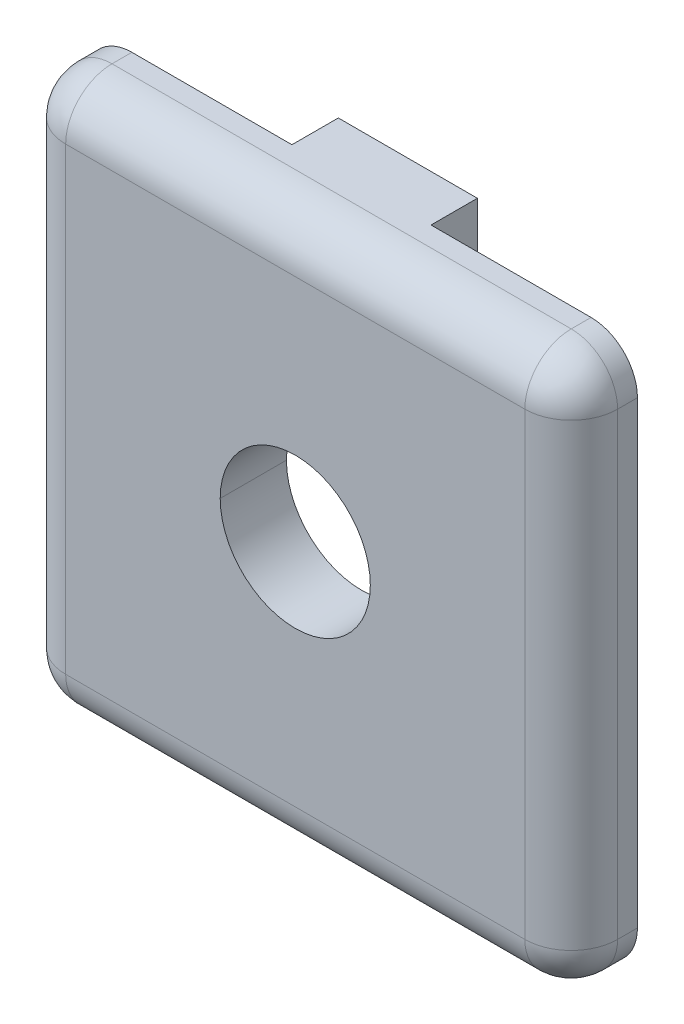
ISO-10303-21;
HEADER;
FILE_DESCRIPTION(('STEP AP214'),'2;1');
FILE_NAME('part.step','',(''),(''),'','','');
FILE_SCHEMA(('AUTOMOTIVE_DESIGN { 1 0 10303 214 1 1 1 1 }'));
ENDSEC;
DATA;
#1=APPLICATION_CONTEXT('core data for automotive mechanical design processes');
#2=APPLICATION_PROTOCOL_DEFINITION('international standard','automotive_design',2000,#1);
#3=PRODUCT_CONTEXT('',#1,'mechanical');
#4=PRODUCT('Part','Part','',(#3));
#5=PRODUCT_RELATED_PRODUCT_CATEGORY('part','',(#4));
#6=PRODUCT_DEFINITION_FORMATION('','',#4);
#7=PRODUCT_DEFINITION_CONTEXT('part definition',#1,'design');
#8=PRODUCT_DEFINITION('design','',#6,#7);
#9=PRODUCT_DEFINITION_SHAPE('','',#8);
#10=(LENGTH_UNIT() NAMED_UNIT(*) SI_UNIT(.MILLI.,.METRE.));
#11=(NAMED_UNIT(*) PLANE_ANGLE_UNIT() SI_UNIT($,.RADIAN.));
#12=(NAMED_UNIT(*) SI_UNIT($,.STERADIAN.) SOLID_ANGLE_UNIT());
#13=UNCERTAINTY_MEASURE_WITH_UNIT(LENGTH_MEASURE(1.E-05),#10,'distance_accuracy_value','');
#14=(GEOMETRIC_REPRESENTATION_CONTEXT(3) GLOBAL_UNCERTAINTY_ASSIGNED_CONTEXT((#13)) GLOBAL_UNIT_ASSIGNED_CONTEXT((#10,
#11,#12)) REPRESENTATION_CONTEXT('',''));
#15=CARTESIAN_POINT('',(0.,0.,0.));
#16=DIRECTION('',(0.,0.,1.));
#17=DIRECTION('',(1.,0.,0.));
#18=AXIS2_PLACEMENT_3D('',#15,#16,#17);
#19=CARTESIAN_POINT('',(10.4,10.3999999999998,-2.10000000000017));
#20=DIRECTION('',(0.,0.,-1.));
#21=DIRECTION('',(-0.707106781186514,-0.707106781186581,0.));
#22=AXIS2_PLACEMENT_3D('',#19,#20,#21);
#23=SPHERICAL_SURFACE('',#22,2.1);
#24=CARTESIAN_POINT('',(10.3999999999998,10.4,-2.10000000000017));
#25=DIRECTION('',(0.,-1.,0.));
#26=DIRECTION('',(0.,0.,1.));
#27=AXIS2_PLACEMENT_3D('',#24,#25,#26);
#28=CIRCLE('',#27,2.1);
#29=CARTESIAN_POINT('',(12.5,10.4,-2.1));
#30=VERTEX_POINT('',#29);
#31=CARTESIAN_POINT('',(10.4,10.4,0.));
#32=VERTEX_POINT('',#31);
#33=EDGE_CURVE('E11',#30,#32,#28,.T.);
#34=ORIENTED_EDGE('',*,*,#33,.F.);
#35=CARTESIAN_POINT('',(10.4,10.4,-2.1));
#36=DIRECTION('',(0.,0.,-1.));
#37=DIRECTION('',(-1.,0.,0.));
#38=AXIS2_PLACEMENT_3D('',#35,#36,#37);
#39=CIRCLE('',#38,2.1);
#40=CARTESIAN_POINT('',(10.4,12.5,-2.1));
#41=VERTEX_POINT('',#40);
#42=EDGE_CURVE('E25',#41,#30,#39,.T.);
#43=ORIENTED_EDGE('',*,*,#42,.F.);
#44=CARTESIAN_POINT('',(10.4,10.4000000000004,-2.09999999999957));
#45=DIRECTION('',(1.,0.,0.));
#46=DIRECTION('',(0.,0.,-1.));
#47=AXIS2_PLACEMENT_3D('',#44,#45,#46);
#48=CIRCLE('',#47,2.1);
#49=EDGE_CURVE('E370',#41,#32,#48,.T.);
#50=ORIENTED_EDGE('',*,*,#49,.T.);
#51=EDGE_LOOP('',(#34,#43,#50));
#52=FACE_BOUND('',#51,.T.);
#53=ADVANCED_FACE('F17',(#52),#23,.T.);
#54=CARTESIAN_POINT('',(10.4,10.4000000000004,-2.09999999999957));
#55=DIRECTION('',(1.,0.,0.));
#56=DIRECTION('',(0.,-0.707106781186552,-0.707106781186543));
#57=AXIS2_PLACEMENT_3D('',#54,#55,#56);
#58=CYLINDRICAL_SURFACE('',#57,2.1);
#59=CARTESIAN_POINT('',(-10.4,10.4000000000004,-2.09999999999957));
#60=DIRECTION('',(1.,0.,0.));
#61=DIRECTION('',(0.,0.,-1.));
#62=AXIS2_PLACEMENT_3D('',#59,#60,#61);
#63=CIRCLE('',#62,2.1);
#64=CARTESIAN_POINT('',(-10.4,12.5,-2.1));
#65=VERTEX_POINT('',#64);
#66=CARTESIAN_POINT('',(-10.4,10.4,0.));
#67=VERTEX_POINT('',#66);
#68=EDGE_CURVE('E366',#65,#67,#63,.T.);
#69=ORIENTED_EDGE('',*,*,#68,.T.);
#70=DIRECTION('',(-1.,0.,0.));
#71=VECTOR('',#70,1.);
#72=CARTESIAN_POINT('',(10.4,10.4,0.));
#73=LINE('',#72,#71);
#74=EDGE_CURVE('E361',#32,#67,#73,.T.);
#75=ORIENTED_EDGE('',*,*,#74,.F.);
#76=ORIENTED_EDGE('',*,*,#49,.F.);
#77=DIRECTION('',(-1.,0.,0.));
#78=VECTOR('',#77,1.);
#79=CARTESIAN_POINT('',(10.4,12.5,-2.1));
#80=LINE('',#79,#78);
#81=EDGE_CURVE('E357',#41,#65,#80,.T.);
#82=ORIENTED_EDGE('',*,*,#81,.T.);
#83=EDGE_LOOP('',(#69,#75,#76,#82));
#84=FACE_BOUND('',#83,.T.);
#85=ADVANCED_FACE('F406',(#84),#58,.T.);
#86=CARTESIAN_POINT('',(10.4,12.5,-3.));
#87=DIRECTION('',(0.,-1.,0.));
#88=DIRECTION('',(0.,0.,-1.));
#89=AXIS2_PLACEMENT_3D('',#86,#87,#88);
#90=PLANE('',#89);
#91=DIRECTION('',(0.,0.,1.));
#92=VECTOR('',#91,1.);
#93=CARTESIAN_POINT('',(-10.4,12.5,-3.));
#94=LINE('',#93,#92);
#95=CARTESIAN_POINT('',(-10.4,12.5,-3.));
#96=VERTEX_POINT('',#95);
#97=EDGE_CURVE('E352',#96,#65,#94,.T.);
#98=ORIENTED_EDGE('',*,*,#97,.T.);
#99=ORIENTED_EDGE('',*,*,#81,.F.);
#100=DIRECTION('',(0.,0.,1.));
#101=VECTOR('',#100,1.);
#102=CARTESIAN_POINT('',(10.4,12.5,-3.));
#103=LINE('',#102,#101);
#104=CARTESIAN_POINT('',(10.4,12.5,-3.));
#105=VERTEX_POINT('',#104);
#106=EDGE_CURVE('E347',#105,#41,#103,.T.);
#107=ORIENTED_EDGE('',*,*,#106,.F.);
#108=DIRECTION('',(-1.,0.,0.));
#109=VECTOR('',#108,1.);
#110=CARTESIAN_POINT('',(10.4,12.5,-3.));
#111=LINE('',#110,#109);
#112=CARTESIAN_POINT('',(3.15,12.5,-3.));
#113=VERTEX_POINT('',#112);
#114=EDGE_CURVE('E343',#105,#113,#111,.T.);
#115=ORIENTED_EDGE('',*,*,#114,.T.);
#116=DIRECTION('',(0.,0.,1.));
#117=VECTOR('',#116,1.);
#118=CARTESIAN_POINT('',(3.15,12.5,-5.1));
#119=LINE('',#118,#117);
#120=CARTESIAN_POINT('',(3.15,12.5,-5.1));
#121=VERTEX_POINT('',#120);
#122=EDGE_CURVE('E338',#121,#113,#119,.T.);
#123=ORIENTED_EDGE('',*,*,#122,.F.);
#124=DIRECTION('',(-1.,0.,0.));
#125=VECTOR('',#124,1.);
#126=CARTESIAN_POINT('',(3.15,12.5,-5.1));
#127=LINE('',#126,#125);
#128=CARTESIAN_POINT('',(-3.15,12.5,-5.1));
#129=VERTEX_POINT('',#128);
#130=EDGE_CURVE('E334',#121,#129,#127,.T.);
#131=ORIENTED_EDGE('',*,*,#130,.T.);
#132=DIRECTION('',(0.,0.,1.));
#133=VECTOR('',#132,1.);
#134=CARTESIAN_POINT('',(-3.15,12.5,-5.1));
#135=LINE('',#134,#133);
#136=CARTESIAN_POINT('',(-3.15,12.5,-3.));
#137=VERTEX_POINT('',#136);
#138=EDGE_CURVE('E148',#129,#137,#135,.T.);
#139=ORIENTED_EDGE('',*,*,#138,.T.);
#140=DIRECTION('',(-1.,0.,0.));
#141=VECTOR('',#140,1.);
#142=CARTESIAN_POINT('',(10.4,12.5,-3.));
#143=LINE('',#142,#141);
#144=EDGE_CURVE('E327',#137,#96,#143,.T.);
#145=ORIENTED_EDGE('',*,*,#144,.T.);
#146=EDGE_LOOP('',(#98,#99,#107,#115,#123,#131,#139,#145));
#147=FACE_BOUND('',#146,.T.);
#148=ADVANCED_FACE('F385',(#147),#90,.F.);
#149=CARTESIAN_POINT('',(10.4,10.4,-3.));
#150=DIRECTION('',(0.,0.,1.));
#151=DIRECTION('',(1.,0.,0.));
#152=AXIS2_PLACEMENT_3D('',#149,#150,#151);
#153=PLANE('',#152);
#154=CARTESIAN_POINT('',(0.,0.,-3.));
#155=DIRECTION('',(0.,0.,1.));
#156=DIRECTION('',(1.,0.,0.));
#157=AXIS2_PLACEMENT_3D('',#154,#155,#156);
#158=CIRCLE('',#157,3.4);
#159=CARTESIAN_POINT('',(3.4,0.,-3.));
#160=VERTEX_POINT('',#159);
#161=CARTESIAN_POINT('',(-3.4,0.,-3.));
#162=VERTEX_POINT('',#161);
#163=EDGE_CURVE('E323',#160,#162,#158,.T.);
#164=ORIENTED_EDGE('',*,*,#163,.T.);
#165=CARTESIAN_POINT('',(0.,0.,-3.));
#166=DIRECTION('',(0.,0.,1.));
#167=DIRECTION('',(1.,0.,0.));
#168=AXIS2_PLACEMENT_3D('',#165,#166,#167);
#169=CIRCLE('',#168,3.4);
#170=EDGE_CURVE('E319',#162,#160,#169,.T.);
#171=ORIENTED_EDGE('',*,*,#170,.T.);
#172=EDGE_LOOP('',(#164,#171));
#173=FACE_BOUND('',#172,.T.);
#174=ORIENTED_EDGE('',*,*,#144,.F.);
#175=DIRECTION('',(0.,-1.,0.));
#176=VECTOR('',#175,1.);
#177=CARTESIAN_POINT('',(-3.15,12.5,-3.));
#178=LINE('',#177,#176);
#179=CARTESIAN_POINT('',(-3.15,10.4,-3.));
#180=VERTEX_POINT('',#179);
#181=EDGE_CURVE('E315',#137,#180,#178,.T.);
#182=ORIENTED_EDGE('',*,*,#181,.T.);
#183=DIRECTION('',(1.,0.,0.));
#184=VECTOR('',#183,1.);
#185=CARTESIAN_POINT('',(-3.15,10.4,-3.));
#186=LINE('',#185,#184);
#187=CARTESIAN_POINT('',(3.15,10.4,-3.));
#188=VERTEX_POINT('',#187);
#189=EDGE_CURVE('E143',#180,#188,#186,.T.);
#190=ORIENTED_EDGE('',*,*,#189,.T.);
#191=DIRECTION('',(0.,1.,0.));
#192=VECTOR('',#191,1.);
#193=CARTESIAN_POINT('',(3.15,10.4,-3.));
#194=LINE('',#193,#192);
#195=EDGE_CURVE('E307',#188,#113,#194,.T.);
#196=ORIENTED_EDGE('',*,*,#195,.T.);
#197=ORIENTED_EDGE('',*,*,#114,.F.);
#198=CARTESIAN_POINT('',(10.4,10.4,-3.));
#199=DIRECTION('',(0.,0.,-1.));
#200=DIRECTION('',(-1.,0.,0.));
#201=AXIS2_PLACEMENT_3D('',#198,#199,#200);
#202=CIRCLE('',#201,2.1);
#203=CARTESIAN_POINT('',(12.5,10.4,-3.));
#204=VERTEX_POINT('',#203);
#205=EDGE_CURVE('E303',#105,#204,#202,.T.);
#206=ORIENTED_EDGE('',*,*,#205,.T.);
#207=DIRECTION('',(0.,1.,0.));
#208=VECTOR('',#207,1.);
#209=CARTESIAN_POINT('',(12.5,-10.4,-3.));
#210=LINE('',#209,#208);
#211=CARTESIAN_POINT('',(12.5,-10.4,-3.));
#212=VERTEX_POINT('',#211);
#213=EDGE_CURVE('E298',#212,#204,#210,.T.);
#214=ORIENTED_EDGE('',*,*,#213,.F.);
#215=CARTESIAN_POINT('',(10.4,-10.4,-3.));
#216=DIRECTION('',(0.,0.,-1.));
#217=DIRECTION('',(-1.,0.,0.));
#218=AXIS2_PLACEMENT_3D('',#215,#216,#217);
#219=CIRCLE('',#218,2.1);
#220=CARTESIAN_POINT('',(10.4,-12.5,-3.));
#221=VERTEX_POINT('',#220);
#222=EDGE_CURVE('E294',#212,#221,#219,.T.);
#223=ORIENTED_EDGE('',*,*,#222,.T.);
#224=DIRECTION('',(1.,0.,0.));
#225=VECTOR('',#224,1.);
#226=CARTESIAN_POINT('',(-10.4,-12.5,-3.));
#227=LINE('',#226,#225);
#228=CARTESIAN_POINT('',(-10.4,-12.5,-3.));
#229=VERTEX_POINT('',#228);
#230=EDGE_CURVE('E289',#229,#221,#227,.T.);
#231=ORIENTED_EDGE('',*,*,#230,.F.);
#232=CARTESIAN_POINT('',(-10.4,-10.4,-3.));
#233=DIRECTION('',(0.,0.,-1.));
#234=DIRECTION('',(-1.,0.,0.));
#235=AXIS2_PLACEMENT_3D('',#232,#233,#234);
#236=CIRCLE('',#235,2.1);
#237=CARTESIAN_POINT('',(-12.5,-10.4,-3.));
#238=VERTEX_POINT('',#237);
#239=EDGE_CURVE('E285',#229,#238,#236,.T.);
#240=ORIENTED_EDGE('',*,*,#239,.T.);
#241=DIRECTION('',(0.,-1.,0.));
#242=VECTOR('',#241,1.);
#243=CARTESIAN_POINT('',(-12.5,10.4,-3.));
#244=LINE('',#243,#242);
#245=CARTESIAN_POINT('',(-12.5,10.4,-3.));
#246=VERTEX_POINT('',#245);
#247=EDGE_CURVE('E280',#246,#238,#244,.T.);
#248=ORIENTED_EDGE('',*,*,#247,.F.);
#249=CARTESIAN_POINT('',(-10.4,10.4,-3.));
#250=DIRECTION('',(0.,0.,1.));
#251=DIRECTION('',(1.,0.,0.));
#252=AXIS2_PLACEMENT_3D('',#249,#250,#251);
#253=CIRCLE('',#252,2.1);
#254=EDGE_CURVE('E275',#96,#246,#253,.T.);
#255=ORIENTED_EDGE('',*,*,#254,.F.);
#256=EDGE_LOOP('',(#174,#182,#190,#196,#197,#206,#214,#223,#231,#240,#248,#255));
#257=FACE_BOUND('',#256,.T.);
#258=ADVANCED_FACE('F388',(#173,#257),#153,.F.);
#259=CARTESIAN_POINT('',(-10.4,10.4,0.));
#260=DIRECTION('',(0.,0.,-1.));
#261=DIRECTION('',(0.707106781186547,-0.707106781186548,0.));
#262=AXIS2_PLACEMENT_3D('',#259,#260,#261);
#263=CYLINDRICAL_SURFACE('',#262,2.1);
#264=CARTESIAN_POINT('',(-10.4,10.4,-2.1));
#265=DIRECTION('',(0.,0.,1.));
#266=DIRECTION('',(1.,0.,0.));
#267=AXIS2_PLACEMENT_3D('',#264,#265,#266);
#268=CIRCLE('',#267,2.1);
#269=CARTESIAN_POINT('',(-12.5,10.4,-2.1));
#270=VERTEX_POINT('',#269);
#271=EDGE_CURVE('E270',#65,#270,#268,.T.);
#272=ORIENTED_EDGE('',*,*,#271,.F.);
#273=ORIENTED_EDGE('',*,*,#97,.F.);
#274=ORIENTED_EDGE('',*,*,#254,.T.);
#275=DIRECTION('',(0.,0.,1.));
#276=VECTOR('',#275,1.);
#277=CARTESIAN_POINT('',(-12.5,10.4,-3.));
#278=LINE('',#277,#276);
#279=EDGE_CURVE('E266',#246,#270,#278,.T.);
#280=ORIENTED_EDGE('',*,*,#279,.T.);
#281=EDGE_LOOP('',(#272,#273,#274,#280));
#282=FACE_BOUND('',#281,.T.);
#283=ADVANCED_FACE('F397',(#282),#263,.T.);
#284=CARTESIAN_POINT('',(-12.5,10.4,-3.));
#285=DIRECTION('',(1.,0.,0.));
#286=DIRECTION('',(0.,0.,-1.));
#287=AXIS2_PLACEMENT_3D('',#284,#285,#286);
#288=PLANE('',#287);
#289=DIRECTION('',(0.,0.,-1.));
#290=VECTOR('',#289,1.);
#291=CARTESIAN_POINT('',(-12.5,-10.4,-2.1));
#292=LINE('',#291,#290);
#293=CARTESIAN_POINT('',(-12.5,-10.4,-2.1));
#294=VERTEX_POINT('',#293);
#295=EDGE_CURVE('E261',#294,#238,#292,.T.);
#296=ORIENTED_EDGE('',*,*,#295,.F.);
#297=DIRECTION('',(0.,-1.,0.));
#298=VECTOR('',#297,1.);
#299=CARTESIAN_POINT('',(-12.5,10.4,-2.1));
#300=LINE('',#299,#298);
#301=EDGE_CURVE('E256',#270,#294,#300,.T.);
#302=ORIENTED_EDGE('',*,*,#301,.F.);
#303=ORIENTED_EDGE('',*,*,#279,.F.);
#304=ORIENTED_EDGE('',*,*,#247,.T.);
#305=EDGE_LOOP('',(#296,#302,#303,#304));
#306=FACE_BOUND('',#305,.T.);
#307=ADVANCED_FACE('F441',(#306),#288,.F.);
#308=CARTESIAN_POINT('',(-10.3999999999998,10.4,-2.10000000000017));
#309=DIRECTION('',(0.,1.,0.));
#310=DIRECTION('',(0.707106781186581,0.,-0.707106781186514));
#311=AXIS2_PLACEMENT_3D('',#308,#309,#310);
#312=CYLINDRICAL_SURFACE('',#311,2.1);
#313=CARTESIAN_POINT('',(-10.3999999999998,-10.4,-2.10000000000017));
#314=DIRECTION('',(0.,1.,0.));
#315=DIRECTION('',(0.,0.,1.));
#316=AXIS2_PLACEMENT_3D('',#313,#314,#315);
#317=CIRCLE('',#316,2.1);
#318=CARTESIAN_POINT('',(-10.4,-10.4,0.));
#319=VERTEX_POINT('',#318);
#320=EDGE_CURVE('E252',#294,#319,#317,.T.);
#321=ORIENTED_EDGE('',*,*,#320,.T.);
#322=DIRECTION('',(0.,-1.,0.));
#323=VECTOR('',#322,1.);
#324=CARTESIAN_POINT('',(-10.4,10.4,0.));
#325=LINE('',#324,#323);
#326=EDGE_CURVE('E247',#67,#319,#325,.T.);
#327=ORIENTED_EDGE('',*,*,#326,.F.);
#328=CARTESIAN_POINT('',(-10.4,10.4,-2.1));
#329=DIRECTION('',(0.,-1.,0.));
#330=DIRECTION('',(0.,0.,1.));
#331=AXIS2_PLACEMENT_3D('',#328,#329,#330);
#332=CIRCLE('',#331,2.1);
#333=EDGE_CURVE('E242',#67,#270,#332,.T.);
#334=ORIENTED_EDGE('',*,*,#333,.T.);
#335=ORIENTED_EDGE('',*,*,#301,.T.);
#336=EDGE_LOOP('',(#321,#327,#334,#335));
#337=FACE_BOUND('',#336,.T.);
#338=ADVANCED_FACE('F408',(#337),#312,.T.);
#339=CARTESIAN_POINT('',(-10.4,10.4,-2.1));
#340=DIRECTION('',(0.,0.,1.));
#341=DIRECTION('',(0.707106781186547,-0.707106781186548,0.));
#342=AXIS2_PLACEMENT_3D('',#339,#340,#341);
#343=SPHERICAL_SURFACE('',#342,2.1);
#344=ORIENTED_EDGE('',*,*,#68,.F.);
#345=ORIENTED_EDGE('',*,*,#271,.T.);
#346=ORIENTED_EDGE('',*,*,#333,.F.);
#347=EDGE_LOOP('',(#344,#345,#346));
#348=FACE_BOUND('',#347,.T.);
#349=ADVANCED_FACE('F402',(#348),#343,.T.);
#350=CARTESIAN_POINT('',(0.,0.,0.));
#351=DIRECTION('',(0.,0.,1.));
#352=DIRECTION('',(1.,0.,0.));
#353=AXIS2_PLACEMENT_3D('',#350,#351,#352);
#354=PLANE('',#353);
#355=CARTESIAN_POINT('',(0.,0.,0.));
#356=DIRECTION('',(0.,0.,1.));
#357=DIRECTION('',(1.,0.,0.));
#358=AXIS2_PLACEMENT_3D('',#355,#356,#357);
#359=CIRCLE('',#358,3.4);
#360=CARTESIAN_POINT('',(3.4,0.,0.));
#361=VERTEX_POINT('',#360);
#362=CARTESIAN_POINT('',(-3.4,0.,0.));
#363=VERTEX_POINT('',#362);
#364=EDGE_CURVE('E237',#361,#363,#359,.T.);
#365=ORIENTED_EDGE('',*,*,#364,.F.);
#366=CARTESIAN_POINT('',(0.,0.,0.));
#367=DIRECTION('',(0.,0.,1.));
#368=DIRECTION('',(1.,0.,0.));
#369=AXIS2_PLACEMENT_3D('',#366,#367,#368);
#370=CIRCLE('',#369,3.4);
#371=EDGE_CURVE('E232',#363,#361,#370,.T.);
#372=ORIENTED_EDGE('',*,*,#371,.F.);
#373=EDGE_LOOP('',(#365,#372));
#374=FACE_BOUND('',#373,.T.);
#375=ORIENTED_EDGE('',*,*,#74,.T.);
#376=ORIENTED_EDGE('',*,*,#326,.T.);
#377=DIRECTION('',(1.,0.,0.));
#378=VECTOR('',#377,1.);
#379=CARTESIAN_POINT('',(-10.4,-10.4,0.));
#380=LINE('',#379,#378);
#381=CARTESIAN_POINT('',(10.4,-10.4,0.));
#382=VERTEX_POINT('',#381);
#383=EDGE_CURVE('E228',#319,#382,#380,.T.);
#384=ORIENTED_EDGE('',*,*,#383,.T.);
#385=DIRECTION('',(0.,1.,0.));
#386=VECTOR('',#385,1.);
#387=CARTESIAN_POINT('',(10.4,-10.4,0.));
#388=LINE('',#387,#386);
#389=EDGE_CURVE('E223',#382,#32,#388,.T.);
#390=ORIENTED_EDGE('',*,*,#389,.T.);
#391=EDGE_LOOP('',(#375,#376,#384,#390));
#392=FACE_BOUND('',#391,.T.);
#393=ADVANCED_FACE('F411',(#374,#392),#354,.T.);
#394=CARTESIAN_POINT('',(10.3999999999998,-10.4,-2.10000000000017));
#395=DIRECTION('',(0.,-1.,0.));
#396=DIRECTION('',(-0.707106781186548,0.,-0.707106781186547));
#397=AXIS2_PLACEMENT_3D('',#394,#395,#396);
#398=CYLINDRICAL_SURFACE('',#397,2.1);
#399=ORIENTED_EDGE('',*,*,#33,.T.);
#400=ORIENTED_EDGE('',*,*,#389,.F.);
#401=CARTESIAN_POINT('',(10.3999999999998,-10.4,-2.10000000000017));
#402=DIRECTION('',(0.,-1.,0.));
#403=DIRECTION('',(1.,0.,0.));
#404=AXIS2_PLACEMENT_3D('',#401,#402,#403);
#405=CIRCLE('',#404,2.1);
#406=CARTESIAN_POINT('',(12.5,-10.4,-2.1));
#407=VERTEX_POINT('',#406);
#408=EDGE_CURVE('E218',#407,#382,#405,.T.);
#409=ORIENTED_EDGE('',*,*,#408,.F.);
#410=DIRECTION('',(0.,1.,0.));
#411=VECTOR('',#410,1.);
#412=CARTESIAN_POINT('',(12.5,-10.4,-2.1));
#413=LINE('',#412,#411);
#414=EDGE_CURVE('E214',#407,#30,#413,.T.);
#415=ORIENTED_EDGE('',*,*,#414,.T.);
#416=EDGE_LOOP('',(#399,#400,#409,#415));
#417=FACE_BOUND('',#416,.T.);
#418=ADVANCED_FACE('F426',(#417),#398,.T.);
#419=CARTESIAN_POINT('',(12.5,-10.4,-3.));
#420=DIRECTION('',(-1.,0.,0.));
#421=DIRECTION('',(0.,0.,1.));
#422=AXIS2_PLACEMENT_3D('',#419,#420,#421);
#423=PLANE('',#422);
#424=DIRECTION('',(0.,0.,-1.));
#425=VECTOR('',#424,1.);
#426=CARTESIAN_POINT('',(12.5,10.4,-2.1));
#427=LINE('',#426,#425);
#428=EDGE_CURVE('E209',#30,#204,#427,.T.);
#429=ORIENTED_EDGE('',*,*,#428,.F.);
#430=ORIENTED_EDGE('',*,*,#414,.F.);
#431=DIRECTION('',(0.,0.,1.));
#432=VECTOR('',#431,1.);
#433=CARTESIAN_POINT('',(12.5,-10.4,-3.));
#434=LINE('',#433,#432);
#435=EDGE_CURVE('E204',#212,#407,#434,.T.);
#436=ORIENTED_EDGE('',*,*,#435,.F.);
#437=ORIENTED_EDGE('',*,*,#213,.T.);
#438=EDGE_LOOP('',(#429,#430,#436,#437));
#439=FACE_BOUND('',#438,.T.);
#440=ADVANCED_FACE('F429',(#439),#423,.F.);
#441=CARTESIAN_POINT('',(10.4,-10.4,-3.));
#442=DIRECTION('',(0.,0.,1.));
#443=DIRECTION('',(-0.707106781186548,0.707106781186548,0.));
#444=AXIS2_PLACEMENT_3D('',#441,#442,#443);
#445=CYLINDRICAL_SURFACE('',#444,2.1);
#446=ORIENTED_EDGE('',*,*,#222,.F.);
#447=ORIENTED_EDGE('',*,*,#435,.T.);
#448=CARTESIAN_POINT('',(10.4,-10.4,-2.1));
#449=DIRECTION('',(0.,0.,-1.));
#450=DIRECTION('',(-1.,0.,0.));
#451=AXIS2_PLACEMENT_3D('',#448,#449,#450);
#452=CIRCLE('',#451,2.1);
#453=CARTESIAN_POINT('',(10.4,-12.5,-2.1));
#454=VERTEX_POINT('',#453);
#455=EDGE_CURVE('E200',#407,#454,#452,.T.);
#456=ORIENTED_EDGE('',*,*,#455,.T.);
#457=DIRECTION('',(0.,0.,-1.));
#458=VECTOR('',#457,1.);
#459=CARTESIAN_POINT('',(10.4,-12.5,-2.1));
#460=LINE('',#459,#458);
#461=EDGE_CURVE('E195',#454,#221,#460,.T.);
#462=ORIENTED_EDGE('',*,*,#461,.T.);
#463=EDGE_LOOP('',(#446,#447,#456,#462));
#464=FACE_BOUND('',#463,.T.);
#465=ADVANCED_FACE('F432',(#464),#445,.T.);
#466=CARTESIAN_POINT('',(-10.4,-12.5,-3.));
#467=DIRECTION('',(0.,1.,0.));
#468=DIRECTION('',(0.,0.,1.));
#469=AXIS2_PLACEMENT_3D('',#466,#467,#468);
#470=PLANE('',#469);
#471=ORIENTED_EDGE('',*,*,#461,.F.);
#472=DIRECTION('',(1.,0.,0.));
#473=VECTOR('',#472,1.);
#474=CARTESIAN_POINT('',(-10.4,-12.5,-2.1));
#475=LINE('',#474,#473);
#476=CARTESIAN_POINT('',(-10.4,-12.5,-2.1));
#477=VERTEX_POINT('',#476);
#478=EDGE_CURVE('E190',#477,#454,#475,.T.);
#479=ORIENTED_EDGE('',*,*,#478,.F.);
#480=DIRECTION('',(0.,0.,1.));
#481=VECTOR('',#480,1.);
#482=CARTESIAN_POINT('',(-10.4,-12.5,-3.));
#483=LINE('',#482,#481);
#484=EDGE_CURVE('E185',#229,#477,#483,.T.);
#485=ORIENTED_EDGE('',*,*,#484,.F.);
#486=ORIENTED_EDGE('',*,*,#230,.T.);
#487=EDGE_LOOP('',(#471,#479,#485,#486));
#488=FACE_BOUND('',#487,.T.);
#489=ADVANCED_FACE('F437',(#488),#470,.F.);
#490=CARTESIAN_POINT('',(-10.4,-10.4,-3.));
#491=DIRECTION('',(0.,0.,1.));
#492=DIRECTION('',(0.707106781186547,0.707106781186548,0.));
#493=AXIS2_PLACEMENT_3D('',#490,#491,#492);
#494=CYLINDRICAL_SURFACE('',#493,2.1);
#495=ORIENTED_EDGE('',*,*,#239,.F.);
#496=ORIENTED_EDGE('',*,*,#484,.T.);
#497=CARTESIAN_POINT('',(-10.4,-10.4,-2.1));
#498=DIRECTION('',(0.,0.,-1.));
#499=DIRECTION('',(-1.,0.,0.));
#500=AXIS2_PLACEMENT_3D('',#497,#498,#499);
#501=CIRCLE('',#500,2.1);
#502=EDGE_CURVE('E180',#477,#294,#501,.T.);
#503=ORIENTED_EDGE('',*,*,#502,.T.);
#504=ORIENTED_EDGE('',*,*,#295,.T.);
#505=EDGE_LOOP('',(#495,#496,#503,#504));
#506=FACE_BOUND('',#505,.T.);
#507=ADVANCED_FACE('F439',(#506),#494,.T.);
#508=CARTESIAN_POINT('',(-10.4,-10.3999999999998,-2.10000000000017));
#509=DIRECTION('',(0.,0.,-1.));
#510=DIRECTION('',(0.707106781186514,0.707106781186581,0.));
#511=AXIS2_PLACEMENT_3D('',#508,#509,#510);
#512=SPHERICAL_SURFACE('',#511,2.1);
#513=ORIENTED_EDGE('',*,*,#320,.F.);
#514=ORIENTED_EDGE('',*,*,#502,.F.);
#515=CARTESIAN_POINT('',(-10.4,-10.3999999999998,-2.10000000000017));
#516=DIRECTION('',(-1.,0.,0.));
#517=DIRECTION('',(0.,-1.,0.));
#518=AXIS2_PLACEMENT_3D('',#515,#516,#517);
#519=CIRCLE('',#518,2.1);
#520=EDGE_CURVE('E175',#477,#319,#519,.T.);
#521=ORIENTED_EDGE('',*,*,#520,.T.);
#522=EDGE_LOOP('',(#513,#514,#521));
#523=FACE_BOUND('',#522,.T.);
#524=ADVANCED_FACE('F417',(#523),#512,.T.);
#525=CARTESIAN_POINT('',(-10.4,-10.3999999999998,-2.10000000000017));
#526=DIRECTION('',(-1.,0.,0.));
#527=DIRECTION('',(0.,0.707106781186548,-0.707106781186548));
#528=AXIS2_PLACEMENT_3D('',#525,#526,#527);
#529=CYLINDRICAL_SURFACE('',#528,2.1);
#530=CARTESIAN_POINT('',(10.4,-10.3999999999998,-2.10000000000017));
#531=DIRECTION('',(-1.,0.,0.));
#532=DIRECTION('',(0.,0.,1.));
#533=AXIS2_PLACEMENT_3D('',#530,#531,#532);
#534=CIRCLE('',#533,2.1);
#535=EDGE_CURVE('E170',#454,#382,#534,.T.);
#536=ORIENTED_EDGE('',*,*,#535,.T.);
#537=ORIENTED_EDGE('',*,*,#383,.F.);
#538=ORIENTED_EDGE('',*,*,#520,.F.);
#539=ORIENTED_EDGE('',*,*,#478,.T.);
#540=EDGE_LOOP('',(#536,#537,#538,#539));
#541=FACE_BOUND('',#540,.T.);
#542=ADVANCED_FACE('F419',(#541),#529,.T.);
#543=CARTESIAN_POINT('',(10.3999999999998,-10.4,-2.10000000000017));
#544=DIRECTION('',(0.,0.,-1.));
#545=DIRECTION('',(-0.707106781186581,0.707106781186514,0.));
#546=AXIS2_PLACEMENT_3D('',#543,#544,#545);
#547=SPHERICAL_SURFACE('',#546,2.1);
#548=ORIENTED_EDGE('',*,*,#535,.F.);
#549=ORIENTED_EDGE('',*,*,#455,.F.);
#550=ORIENTED_EDGE('',*,*,#408,.T.);
#551=EDGE_LOOP('',(#548,#549,#550));
#552=FACE_BOUND('',#551,.T.);
#553=ADVANCED_FACE('F423',(#552),#547,.T.);
#554=CARTESIAN_POINT('',(10.4,10.4,-3.));
#555=DIRECTION('',(0.,0.,1.));
#556=DIRECTION('',(-0.707106781186547,-0.707106781186548,0.));
#557=AXIS2_PLACEMENT_3D('',#554,#555,#556);
#558=CYLINDRICAL_SURFACE('',#557,2.1);
#559=ORIENTED_EDGE('',*,*,#205,.F.);
#560=ORIENTED_EDGE('',*,*,#106,.T.);
#561=ORIENTED_EDGE('',*,*,#42,.T.);
#562=ORIENTED_EDGE('',*,*,#428,.T.);
#563=EDGE_LOOP('',(#559,#560,#561,#562));
#564=FACE_BOUND('',#563,.T.);
#565=ADVANCED_FACE('F380',(#564),#558,.T.);
#566=CARTESIAN_POINT('',(0.,0.,3.));
#567=DIRECTION('',(0.,0.,1.));
#568=DIRECTION('',(0.,1.,0.));
#569=AXIS2_PLACEMENT_3D('',#566,#567,#568);
#570=CYLINDRICAL_SURFACE('',#569,3.4);
#571=ORIENTED_EDGE('',*,*,#170,.F.);
#572=DIRECTION('',(0.,0.,1.));
#573=VECTOR('',#572,1.);
#574=CARTESIAN_POINT('',(-3.4,0.,-3.));
#575=LINE('',#574,#573);
#576=EDGE_CURVE('E165',#162,#363,#575,.T.);
#577=ORIENTED_EDGE('',*,*,#576,.T.);
#578=ORIENTED_EDGE('',*,*,#371,.T.);
#579=DIRECTION('',(0.,0.,1.));
#580=VECTOR('',#579,1.);
#581=CARTESIAN_POINT('',(3.4,0.,-3.));
#582=LINE('',#581,#580);
#583=EDGE_CURVE('E160',#160,#361,#582,.T.);
#584=ORIENTED_EDGE('',*,*,#583,.F.);
#585=EDGE_LOOP('',(#571,#577,#578,#584));
#586=FACE_BOUND('',#585,.T.);
#587=ADVANCED_FACE('F470',(#586),#570,.F.);
#588=CARTESIAN_POINT('',(0.,0.,3.));
#589=DIRECTION('',(0.,0.,1.));
#590=DIRECTION('',(0.,-1.,0.));
#591=AXIS2_PLACEMENT_3D('',#588,#589,#590);
#592=CYLINDRICAL_SURFACE('',#591,3.4);
#593=ORIENTED_EDGE('',*,*,#364,.T.);
#594=ORIENTED_EDGE('',*,*,#576,.F.);
#595=ORIENTED_EDGE('',*,*,#163,.F.);
#596=ORIENTED_EDGE('',*,*,#583,.T.);
#597=EDGE_LOOP('',(#593,#594,#595,#596));
#598=FACE_BOUND('',#597,.T.);
#599=ADVANCED_FACE('F471',(#598),#592,.F.);
#600=CARTESIAN_POINT('',(3.15,10.4,-5.1));
#601=DIRECTION('',(1.,0.,0.));
#602=DIRECTION('',(0.,0.,-1.));
#603=AXIS2_PLACEMENT_3D('',#600,#601,#602);
#604=PLANE('',#603);
#605=ORIENTED_EDGE('',*,*,#195,.F.);
#606=DIRECTION('',(0.,0.,1.));
#607=VECTOR('',#606,1.);
#608=CARTESIAN_POINT('',(3.15,10.4,-5.1));
#609=LINE('',#608,#607);
#610=CARTESIAN_POINT('',(3.15,10.4,-5.1));
#611=VERTEX_POINT('',#610);
#612=EDGE_CURVE('E150',#611,#188,#609,.T.);
#613=ORIENTED_EDGE('',*,*,#612,.F.);
#614=DIRECTION('',(0.,1.,0.));
#615=VECTOR('',#614,1.);
#616=CARTESIAN_POINT('',(3.15,10.4,-5.1));
#617=LINE('',#616,#615);
#618=EDGE_CURVE('E135',#611,#121,#617,.T.);
#619=ORIENTED_EDGE('',*,*,#618,.T.);
#620=ORIENTED_EDGE('',*,*,#122,.T.);
#621=EDGE_LOOP('',(#605,#613,#619,#620));
#622=FACE_BOUND('',#621,.T.);
#623=ADVANCED_FACE('F391',(#622),#604,.T.);
#624=CARTESIAN_POINT('',(0.,0.,-5.1));
#625=DIRECTION('',(0.,0.,1.));
#626=DIRECTION('',(1.,0.,0.));
#627=AXIS2_PLACEMENT_3D('',#624,#625,#626);
#628=PLANE('',#627);
#629=DIRECTION('',(0.,-1.,0.));
#630=VECTOR('',#629,1.);
#631=CARTESIAN_POINT('',(-3.15,12.5,-5.1));
#632=LINE('',#631,#630);
#633=CARTESIAN_POINT('',(-3.15,10.4,-5.1));
#634=VERTEX_POINT('',#633);
#635=EDGE_CURVE('E132',#129,#634,#632,.T.);
#636=ORIENTED_EDGE('',*,*,#635,.F.);
#637=ORIENTED_EDGE('',*,*,#130,.F.);
#638=ORIENTED_EDGE('',*,*,#618,.F.);
#639=DIRECTION('',(1.,0.,0.));
#640=VECTOR('',#639,1.);
#641=CARTESIAN_POINT('',(-3.15,10.4,-5.1));
#642=LINE('',#641,#640);
#643=EDGE_CURVE('E127',#634,#611,#642,.T.);
#644=ORIENTED_EDGE('',*,*,#643,.F.);
#645=EDGE_LOOP('',(#636,#637,#638,#644));
#646=FACE_BOUND('',#645,.T.);
#647=ADVANCED_FACE('F129',(#646),#628,.F.);
#648=CARTESIAN_POINT('',(-3.15,10.4,-5.1));
#649=DIRECTION('',(0.,-1.,0.));
#650=DIRECTION('',(0.,0.,-1.));
#651=AXIS2_PLACEMENT_3D('',#648,#649,#650);
#652=PLANE('',#651);
#653=ORIENTED_EDGE('',*,*,#189,.F.);
#654=DIRECTION('',(0.,0.,1.));
#655=VECTOR('',#654,1.);
#656=CARTESIAN_POINT('',(-3.15,10.4,-5.1));
#657=LINE('',#656,#655);
#658=EDGE_CURVE('E138',#634,#180,#657,.T.);
#659=ORIENTED_EDGE('',*,*,#658,.F.);
#660=ORIENTED_EDGE('',*,*,#643,.T.);
#661=ORIENTED_EDGE('',*,*,#612,.T.);
#662=EDGE_LOOP('',(#653,#659,#660,#661));
#663=FACE_BOUND('',#662,.T.);
#664=ADVANCED_FACE('F142',(#663),#652,.T.);
#665=CARTESIAN_POINT('',(-3.15,12.5,-5.1));
#666=DIRECTION('',(-1.,0.,0.));
#667=DIRECTION('',(0.,0.,1.));
#668=AXIS2_PLACEMENT_3D('',#665,#666,#667);
#669=PLANE('',#668);
#670=ORIENTED_EDGE('',*,*,#181,.F.);
#671=ORIENTED_EDGE('',*,*,#138,.F.);
#672=ORIENTED_EDGE('',*,*,#635,.T.);
#673=ORIENTED_EDGE('',*,*,#658,.T.);
#674=EDGE_LOOP('',(#670,#671,#672,#673));
#675=FACE_BOUND('',#674,.T.);
#676=ADVANCED_FACE('F147',(#675),#669,.T.);
#677=CLOSED_SHELL('',(#53,#85,#148,#258,#283,#307,#338,#349,#393,#418,#440,#465,#489,#507,#524,
#542,#553,#565,#587,#599,#623,#647,#664,#676));
#678=MANIFOLD_SOLID_BREP('B1',#677);
#679=ADVANCED_BREP_SHAPE_REPRESENTATION('',(#18,#678),#14);
#680=SHAPE_DEFINITION_REPRESENTATION(#9,#679);
ENDSEC;
END-ISO-10303-21;
